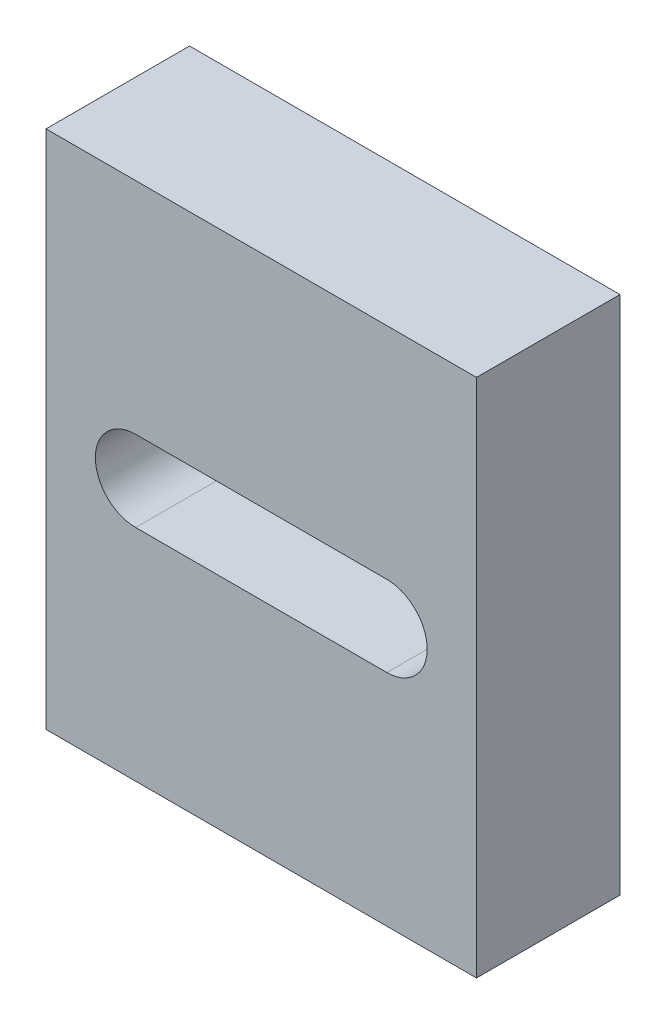
ISO-10303-21;
HEADER;
FILE_DESCRIPTION(('STEP AP214'),'2;1');
FILE_NAME('part.step','',(''),(''),'','','');
FILE_SCHEMA(('AUTOMOTIVE_DESIGN { 1 0 10303 214 1 1 1 1 }'));
ENDSEC;
DATA;
#1=APPLICATION_CONTEXT('core data for automotive mechanical design processes');
#2=APPLICATION_PROTOCOL_DEFINITION('international standard','automotive_design',2000,#1);
#3=PRODUCT_CONTEXT('',#1,'mechanical');
#4=PRODUCT('Part','Part','',(#3));
#5=PRODUCT_RELATED_PRODUCT_CATEGORY('part','',(#4));
#6=PRODUCT_DEFINITION_FORMATION('','',#4);
#7=PRODUCT_DEFINITION_CONTEXT('part definition',#1,'design');
#8=PRODUCT_DEFINITION('design','',#6,#7);
#9=PRODUCT_DEFINITION_SHAPE('','',#8);
#10=(LENGTH_UNIT() NAMED_UNIT(*) SI_UNIT(.MILLI.,.METRE.));
#11=(NAMED_UNIT(*) PLANE_ANGLE_UNIT() SI_UNIT($,.RADIAN.));
#12=(NAMED_UNIT(*) SI_UNIT($,.STERADIAN.) SOLID_ANGLE_UNIT());
#13=UNCERTAINTY_MEASURE_WITH_UNIT(LENGTH_MEASURE(1.E-05),#10,'distance_accuracy_value','');
#14=(GEOMETRIC_REPRESENTATION_CONTEXT(3) GLOBAL_UNCERTAINTY_ASSIGNED_CONTEXT((#13)) GLOBAL_UNIT_ASSIGNED_CONTEXT((#10,
#11,#12)) REPRESENTATION_CONTEXT('',''));
#15=CARTESIAN_POINT('',(0.,0.,0.));
#16=DIRECTION('',(0.,0.,1.));
#17=DIRECTION('',(1.,0.,0.));
#18=AXIS2_PLACEMENT_3D('',#15,#16,#17);
#19=CARTESIAN_POINT('',(-24.,-29.,-16.));
#20=DIRECTION('',(-1.,0.,0.));
#21=DIRECTION('',(0.,0.,1.));
#22=AXIS2_PLACEMENT_3D('',#19,#20,#21);
#23=PLANE('',#22);
#24=DIRECTION('',(0.,-1.,0.));
#25=VECTOR('',#24,1.);
#26=CARTESIAN_POINT('',(-24.,-29.,0.));
#27=LINE('',#26,#25);
#28=CARTESIAN_POINT('',(-24.,29.,0.));
#29=VERTEX_POINT('',#28);
#30=CARTESIAN_POINT('',(-24.,-29.,0.));
#31=VERTEX_POINT('',#30);
#32=EDGE_CURVE('E137',#29,#31,#27,.T.);
#33=ORIENTED_EDGE('',*,*,#32,.F.);
#34=DIRECTION('',(0.,0.,1.));
#35=VECTOR('',#34,1.);
#36=CARTESIAN_POINT('',(-24.,29.,-16.));
#37=LINE('',#36,#35);
#38=CARTESIAN_POINT('',(-24.,29.,-16.));
#39=VERTEX_POINT('',#38);
#40=EDGE_CURVE('E11',#39,#29,#37,.T.);
#41=ORIENTED_EDGE('',*,*,#40,.F.);
#42=DIRECTION('',(0.,-1.,0.));
#43=VECTOR('',#42,1.);
#44=CARTESIAN_POINT('',(-24.,-29.,-16.));
#45=LINE('',#44,#43);
#46=CARTESIAN_POINT('',(-24.,-29.,-16.));
#47=VERTEX_POINT('',#46);
#48=EDGE_CURVE('E141',#39,#47,#45,.T.);
#49=ORIENTED_EDGE('',*,*,#48,.T.);
#50=DIRECTION('',(0.,0.,1.));
#51=VECTOR('',#50,1.);
#52=CARTESIAN_POINT('',(-24.,-29.,-16.));
#53=LINE('',#52,#51);
#54=EDGE_CURVE('E42',#47,#31,#53,.T.);
#55=ORIENTED_EDGE('',*,*,#54,.T.);
#56=EDGE_LOOP('',(#33,#41,#49,#55));
#57=FACE_BOUND('',#56,.T.);
#58=ADVANCED_FACE('F39',(#57),#23,.T.);
#59=CARTESIAN_POINT('',(-24.,29.,-16.));
#60=DIRECTION('',(0.,1.,0.));
#61=DIRECTION('',(0.,0.,1.));
#62=AXIS2_PLACEMENT_3D('',#59,#60,#61);
#63=PLANE('',#62);
#64=DIRECTION('',(-1.,0.,0.));
#65=VECTOR('',#64,1.);
#66=CARTESIAN_POINT('',(-24.,29.,0.));
#67=LINE('',#66,#65);
#68=CARTESIAN_POINT('',(24.,29.,0.));
#69=VERTEX_POINT('',#68);
#70=EDGE_CURVE('E145',#69,#29,#67,.T.);
#71=ORIENTED_EDGE('',*,*,#70,.F.);
#72=DIRECTION('',(0.,0.,1.));
#73=VECTOR('',#72,1.);
#74=CARTESIAN_POINT('',(24.,29.,-16.));
#75=LINE('',#74,#73);
#76=CARTESIAN_POINT('',(24.,29.,-16.));
#77=VERTEX_POINT('',#76);
#78=EDGE_CURVE('E47',#77,#69,#75,.T.);
#79=ORIENTED_EDGE('',*,*,#78,.F.);
#80=DIRECTION('',(-1.,0.,0.));
#81=VECTOR('',#80,1.);
#82=CARTESIAN_POINT('',(-24.,29.,-16.));
#83=LINE('',#82,#81);
#84=EDGE_CURVE('E151',#77,#39,#83,.T.);
#85=ORIENTED_EDGE('',*,*,#84,.T.);
#86=ORIENTED_EDGE('',*,*,#40,.T.);
#87=EDGE_LOOP('',(#71,#79,#85,#86));
#88=FACE_BOUND('',#87,.T.);
#89=ADVANCED_FACE('F177',(#88),#63,.T.);
#90=CARTESIAN_POINT('',(24.,-29.,-16.));
#91=DIRECTION('',(1.,0.,0.));
#92=DIRECTION('',(0.,0.,-1.));
#93=AXIS2_PLACEMENT_3D('',#90,#91,#92);
#94=PLANE('',#93);
#95=DIRECTION('',(0.,1.,0.));
#96=VECTOR('',#95,1.);
#97=CARTESIAN_POINT('',(24.,-29.,0.));
#98=LINE('',#97,#96);
#99=CARTESIAN_POINT('',(24.,-29.,0.));
#100=VERTEX_POINT('',#99);
#101=EDGE_CURVE('E159',#100,#69,#98,.T.);
#102=ORIENTED_EDGE('',*,*,#101,.F.);
#103=DIRECTION('',(0.,0.,1.));
#104=VECTOR('',#103,1.);
#105=CARTESIAN_POINT('',(24.,-29.,-16.));
#106=LINE('',#105,#104);
#107=CARTESIAN_POINT('',(24.,-29.,-16.));
#108=VERTEX_POINT('',#107);
#109=EDGE_CURVE('E164',#108,#100,#106,.T.);
#110=ORIENTED_EDGE('',*,*,#109,.F.);
#111=DIRECTION('',(0.,1.,0.));
#112=VECTOR('',#111,1.);
#113=CARTESIAN_POINT('',(24.,-29.,-16.));
#114=LINE('',#113,#112);
#115=EDGE_CURVE('E148',#108,#77,#114,.T.);
#116=ORIENTED_EDGE('',*,*,#115,.T.);
#117=ORIENTED_EDGE('',*,*,#78,.T.);
#118=EDGE_LOOP('',(#102,#110,#116,#117));
#119=FACE_BOUND('',#118,.T.);
#120=ADVANCED_FACE('F181',(#119),#94,.T.);
#121=CARTESIAN_POINT('',(-24.,-29.,-16.));
#122=DIRECTION('',(0.,-1.,0.));
#123=DIRECTION('',(0.,0.,-1.));
#124=AXIS2_PLACEMENT_3D('',#121,#122,#123);
#125=PLANE('',#124);
#126=DIRECTION('',(1.,0.,0.));
#127=VECTOR('',#126,1.);
#128=CARTESIAN_POINT('',(-24.,-29.,0.));
#129=LINE('',#128,#127);
#130=EDGE_CURVE('E156',#31,#100,#129,.T.);
#131=ORIENTED_EDGE('',*,*,#130,.F.);
#132=ORIENTED_EDGE('',*,*,#54,.F.);
#133=DIRECTION('',(1.,0.,0.));
#134=VECTOR('',#133,1.);
#135=CARTESIAN_POINT('',(-24.,-29.,-16.));
#136=LINE('',#135,#134);
#137=EDGE_CURVE('E144',#47,#108,#136,.T.);
#138=ORIENTED_EDGE('',*,*,#137,.T.);
#139=ORIENTED_EDGE('',*,*,#109,.T.);
#140=EDGE_LOOP('',(#131,#132,#138,#139));
#141=FACE_BOUND('',#140,.T.);
#142=ADVANCED_FACE('F172',(#141),#125,.T.);
#143=CARTESIAN_POINT('',(0.,0.,-16.));
#144=DIRECTION('',(0.,0.,-1.));
#145=DIRECTION('',(-1.,0.,0.));
#146=AXIS2_PLACEMENT_3D('',#143,#144,#145);
#147=PLANE('',#146);
#148=CARTESIAN_POINT('',(-14.,0.,-16.));
#149=DIRECTION('',(0.,0.,1.));
#150=DIRECTION('',(1.,0.,0.));
#151=AXIS2_PLACEMENT_3D('',#148,#149,#150);
#152=CIRCLE('',#151,4.5);
#153=CARTESIAN_POINT('',(-14.,4.5,-16.));
#154=VERTEX_POINT('',#153);
#155=CARTESIAN_POINT('',(-14.,-4.5,-16.));
#156=VERTEX_POINT('',#155);
#157=EDGE_CURVE('E106',#154,#156,#152,.T.);
#158=ORIENTED_EDGE('',*,*,#157,.T.);
#159=DIRECTION('',(1.,0.,0.));
#160=VECTOR('',#159,1.);
#161=CARTESIAN_POINT('',(-14.,-4.5,-16.));
#162=LINE('',#161,#160);
#163=CARTESIAN_POINT('',(14.,-4.5,-16.));
#164=VERTEX_POINT('',#163);
#165=EDGE_CURVE('E115',#156,#164,#162,.T.);
#166=ORIENTED_EDGE('',*,*,#165,.T.);
#167=CARTESIAN_POINT('',(14.,0.,-16.));
#168=DIRECTION('',(0.,0.,1.));
#169=DIRECTION('',(1.,0.,0.));
#170=AXIS2_PLACEMENT_3D('',#167,#168,#169);
#171=CIRCLE('',#170,4.5);
#172=CARTESIAN_POINT('',(14.,4.5,-16.));
#173=VERTEX_POINT('',#172);
#174=EDGE_CURVE('E55',#164,#173,#171,.T.);
#175=ORIENTED_EDGE('',*,*,#174,.T.);
#176=DIRECTION('',(-1.,0.,0.));
#177=VECTOR('',#176,1.);
#178=CARTESIAN_POINT('',(-14.,4.5,-16.));
#179=LINE('',#178,#177);
#180=EDGE_CURVE('E112',#173,#154,#179,.T.);
#181=ORIENTED_EDGE('',*,*,#180,.T.);
#182=EDGE_LOOP('',(#158,#166,#175,#181));
#183=FACE_BOUND('',#182,.T.);
#184=ORIENTED_EDGE('',*,*,#48,.F.);
#185=ORIENTED_EDGE('',*,*,#84,.F.);
#186=ORIENTED_EDGE('',*,*,#115,.F.);
#187=ORIENTED_EDGE('',*,*,#137,.F.);
#188=EDGE_LOOP('',(#184,#185,#186,#187));
#189=FACE_BOUND('',#188,.T.);
#190=ADVANCED_FACE('F119',(#183,#189),#147,.T.);
#191=CARTESIAN_POINT('',(0.,0.,0.));
#192=DIRECTION('',(0.,0.,-1.));
#193=DIRECTION('',(-1.,0.,0.));
#194=AXIS2_PLACEMENT_3D('',#191,#192,#193);
#195=PLANE('',#194);
#196=DIRECTION('',(1.,0.,0.));
#197=VECTOR('',#196,1.);
#198=CARTESIAN_POINT('',(-14.,-4.5,0.));
#199=LINE('',#198,#197);
#200=CARTESIAN_POINT('',(-14.,-4.5,0.));
#201=VERTEX_POINT('',#200);
#202=CARTESIAN_POINT('',(14.,-4.5,0.));
#203=VERTEX_POINT('',#202);
#204=EDGE_CURVE('E131',#201,#203,#199,.T.);
#205=ORIENTED_EDGE('',*,*,#204,.F.);
#206=CARTESIAN_POINT('',(-14.,0.,0.));
#207=DIRECTION('',(0.,0.,1.));
#208=DIRECTION('',(1.,0.,0.));
#209=AXIS2_PLACEMENT_3D('',#206,#207,#208);
#210=CIRCLE('',#209,4.5);
#211=CARTESIAN_POINT('',(-14.,4.5,0.));
#212=VERTEX_POINT('',#211);
#213=EDGE_CURVE('E63',#212,#201,#210,.T.);
#214=ORIENTED_EDGE('',*,*,#213,.F.);
#215=DIRECTION('',(-1.,0.,0.));
#216=VECTOR('',#215,1.);
#217=CARTESIAN_POINT('',(-14.,4.5,0.));
#218=LINE('',#217,#216);
#219=CARTESIAN_POINT('',(14.,4.5,0.));
#220=VERTEX_POINT('',#219);
#221=EDGE_CURVE('E122',#220,#212,#218,.T.);
#222=ORIENTED_EDGE('',*,*,#221,.F.);
#223=CARTESIAN_POINT('',(14.,0.,0.));
#224=DIRECTION('',(0.,0.,1.));
#225=DIRECTION('',(1.,0.,0.));
#226=AXIS2_PLACEMENT_3D('',#223,#224,#225);
#227=CIRCLE('',#226,4.5);
#228=EDGE_CURVE('E125',#203,#220,#227,.T.);
#229=ORIENTED_EDGE('',*,*,#228,.F.);
#230=EDGE_LOOP('',(#205,#214,#222,#229));
#231=FACE_BOUND('',#230,.T.);
#232=ORIENTED_EDGE('',*,*,#32,.T.);
#233=ORIENTED_EDGE('',*,*,#130,.T.);
#234=ORIENTED_EDGE('',*,*,#101,.T.);
#235=ORIENTED_EDGE('',*,*,#70,.T.);
#236=EDGE_LOOP('',(#232,#233,#234,#235));
#237=FACE_BOUND('',#236,.T.);
#238=ADVANCED_FACE('F174',(#231,#237),#195,.F.);
#239=CARTESIAN_POINT('',(-14.,0.,-16.));
#240=DIRECTION('',(0.,0.,1.));
#241=DIRECTION('',(1.,0.,0.));
#242=AXIS2_PLACEMENT_3D('',#239,#240,#241);
#243=CYLINDRICAL_SURFACE('',#242,4.5);
#244=ORIENTED_EDGE('',*,*,#213,.T.);
#245=DIRECTION('',(0.,0.,1.));
#246=VECTOR('',#245,1.);
#247=CARTESIAN_POINT('',(-14.,-4.5,-16.));
#248=LINE('',#247,#246);
#249=EDGE_CURVE('E102',#156,#201,#248,.T.);
#250=ORIENTED_EDGE('',*,*,#249,.F.);
#251=ORIENTED_EDGE('',*,*,#157,.F.);
#252=DIRECTION('',(0.,0.,1.));
#253=VECTOR('',#252,1.);
#254=CARTESIAN_POINT('',(-14.,4.5,-16.));
#255=LINE('',#254,#253);
#256=EDGE_CURVE('E135',#154,#212,#255,.T.);
#257=ORIENTED_EDGE('',*,*,#256,.T.);
#258=EDGE_LOOP('',(#244,#250,#251,#257));
#259=FACE_BOUND('',#258,.T.);
#260=ADVANCED_FACE('F104',(#259),#243,.F.);
#261=CARTESIAN_POINT('',(-14.,4.5,-16.));
#262=DIRECTION('',(0.,1.,0.));
#263=DIRECTION('',(0.,0.,1.));
#264=AXIS2_PLACEMENT_3D('',#261,#262,#263);
#265=PLANE('',#264);
#266=ORIENTED_EDGE('',*,*,#221,.T.);
#267=ORIENTED_EDGE('',*,*,#256,.F.);
#268=ORIENTED_EDGE('',*,*,#180,.F.);
#269=DIRECTION('',(0.,0.,1.));
#270=VECTOR('',#269,1.);
#271=CARTESIAN_POINT('',(14.,4.5,-16.));
#272=LINE('',#271,#270);
#273=EDGE_CURVE('E138',#173,#220,#272,.T.);
#274=ORIENTED_EDGE('',*,*,#273,.T.);
#275=EDGE_LOOP('',(#266,#267,#268,#274));
#276=FACE_BOUND('',#275,.T.);
#277=ADVANCED_FACE('F237',(#276),#265,.F.);
#278=CARTESIAN_POINT('',(14.,0.,-16.));
#279=DIRECTION('',(0.,0.,1.));
#280=DIRECTION('',(1.,0.,0.));
#281=AXIS2_PLACEMENT_3D('',#278,#279,#280);
#282=CYLINDRICAL_SURFACE('',#281,4.5);
#283=ORIENTED_EDGE('',*,*,#228,.T.);
#284=ORIENTED_EDGE('',*,*,#273,.F.);
#285=ORIENTED_EDGE('',*,*,#174,.F.);
#286=DIRECTION('',(0.,0.,1.));
#287=VECTOR('',#286,1.);
#288=CARTESIAN_POINT('',(14.,-4.5,-16.));
#289=LINE('',#288,#287);
#290=EDGE_CURVE('E111',#164,#203,#289,.T.);
#291=ORIENTED_EDGE('',*,*,#290,.T.);
#292=EDGE_LOOP('',(#283,#284,#285,#291));
#293=FACE_BOUND('',#292,.T.);
#294=ADVANCED_FACE('F247',(#293),#282,.F.);
#295=CARTESIAN_POINT('',(-14.,-4.5,-16.));
#296=DIRECTION('',(0.,-1.,0.));
#297=DIRECTION('',(0.,0.,-1.));
#298=AXIS2_PLACEMENT_3D('',#295,#296,#297);
#299=PLANE('',#298);
#300=ORIENTED_EDGE('',*,*,#204,.T.);
#301=ORIENTED_EDGE('',*,*,#290,.F.);
#302=ORIENTED_EDGE('',*,*,#165,.F.);
#303=ORIENTED_EDGE('',*,*,#249,.T.);
#304=EDGE_LOOP('',(#300,#301,#302,#303));
#305=FACE_BOUND('',#304,.T.);
#306=ADVANCED_FACE('F116',(#305),#299,.F.);
#307=CLOSED_SHELL('',(#58,#89,#120,#142,#190,#238,#260,#277,#294,#306));
#308=MANIFOLD_SOLID_BREP('B2',#307);
#309=ADVANCED_BREP_SHAPE_REPRESENTATION('',(#18,#308),#14);
#310=SHAPE_DEFINITION_REPRESENTATION(#9,#309);
ENDSEC;
END-ISO-10303-21;
